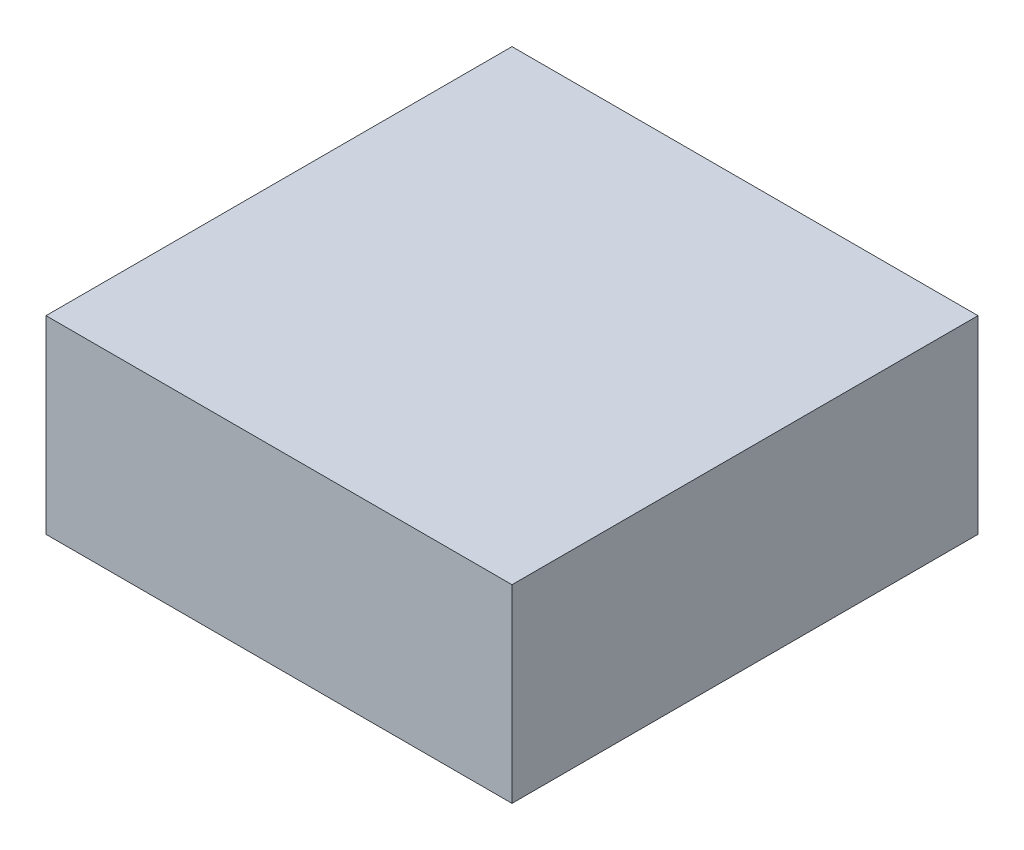
ISO-10303-21;
HEADER;
FILE_DESCRIPTION(('STEP AP214'),'2;1');
FILE_NAME('part.step','',(''),(''),'','','');
FILE_SCHEMA(('AUTOMOTIVE_DESIGN { 1 0 10303 214 1 1 1 1 }'));
ENDSEC;
DATA;
#1=APPLICATION_CONTEXT('core data for automotive mechanical design processes');
#2=APPLICATION_PROTOCOL_DEFINITION('international standard','automotive_design',2000,#1);
#3=PRODUCT_CONTEXT('',#1,'mechanical');
#4=PRODUCT('Part','Part','',(#3));
#5=PRODUCT_RELATED_PRODUCT_CATEGORY('part','',(#4));
#6=PRODUCT_DEFINITION_FORMATION('','',#4);
#7=PRODUCT_DEFINITION_CONTEXT('part definition',#1,'design');
#8=PRODUCT_DEFINITION('design','',#6,#7);
#9=PRODUCT_DEFINITION_SHAPE('','',#8);
#10=(LENGTH_UNIT() NAMED_UNIT(*) SI_UNIT(.MILLI.,.METRE.));
#11=(NAMED_UNIT(*) PLANE_ANGLE_UNIT() SI_UNIT($,.RADIAN.));
#12=(NAMED_UNIT(*) SI_UNIT($,.STERADIAN.) SOLID_ANGLE_UNIT());
#13=UNCERTAINTY_MEASURE_WITH_UNIT(LENGTH_MEASURE(1.E-05),#10,'distance_accuracy_value','');
#14=(GEOMETRIC_REPRESENTATION_CONTEXT(3) GLOBAL_UNCERTAINTY_ASSIGNED_CONTEXT((#13)) GLOBAL_UNIT_ASSIGNED_CONTEXT((#10,
#11,#12)) REPRESENTATION_CONTEXT('',''));
#15=CARTESIAN_POINT('',(0.,0.,0.));
#16=DIRECTION('',(0.,0.,1.));
#17=DIRECTION('',(1.,0.,0.));
#18=AXIS2_PLACEMENT_3D('',#15,#16,#17);
#19=CARTESIAN_POINT('',(7.75,6.3,7.75));
#20=DIRECTION('',(-1.,0.,0.));
#21=DIRECTION('',(0.,0.,1.));
#22=AXIS2_PLACEMENT_3D('',#19,#20,#21);
#23=PLANE('',#22);
#24=DIRECTION('',(0.,0.,-1.));
#25=VECTOR('',#24,1.);
#26=CARTESIAN_POINT('',(7.75,0.,7.75));
#27=LINE('',#26,#25);
#28=CARTESIAN_POINT('',(7.75,0.,7.75));
#29=VERTEX_POINT('',#28);
#30=CARTESIAN_POINT('',(7.75,0.,-7.75));
#31=VERTEX_POINT('',#30);
#32=EDGE_CURVE('E110',#29,#31,#27,.T.);
#33=ORIENTED_EDGE('',*,*,#32,.T.);
#34=DIRECTION('',(0.,-1.,0.));
#35=VECTOR('',#34,1.);
#36=CARTESIAN_POINT('',(7.75,6.3,-7.75));
#37=LINE('',#36,#35);
#38=CARTESIAN_POINT('',(7.75,6.3,-7.75));
#39=VERTEX_POINT('',#38);
#40=EDGE_CURVE('E11',#39,#31,#37,.T.);
#41=ORIENTED_EDGE('',*,*,#40,.F.);
#42=DIRECTION('',(0.,0.,-1.));
#43=VECTOR('',#42,1.);
#44=CARTESIAN_POINT('',(7.75,6.3,7.75));
#45=LINE('',#44,#43);
#46=CARTESIAN_POINT('',(7.75,6.3,7.75));
#47=VERTEX_POINT('',#46);
#48=EDGE_CURVE('E94',#47,#39,#45,.T.);
#49=ORIENTED_EDGE('',*,*,#48,.F.);
#50=DIRECTION('',(0.,-1.,0.));
#51=VECTOR('',#50,1.);
#52=CARTESIAN_POINT('',(7.75,6.3,7.75));
#53=LINE('',#52,#51);
#54=EDGE_CURVE('E106',#47,#29,#53,.T.);
#55=ORIENTED_EDGE('',*,*,#54,.T.);
#56=EDGE_LOOP('',(#33,#41,#49,#55));
#57=FACE_BOUND('',#56,.T.);
#58=ADVANCED_FACE('F42',(#57),#23,.F.);
#59=CARTESIAN_POINT('',(-7.75,6.3,-7.75));
#60=DIRECTION('',(0.,0.,1.));
#61=DIRECTION('',(1.,0.,0.));
#62=AXIS2_PLACEMENT_3D('',#59,#60,#61);
#63=PLANE('',#62);
#64=DIRECTION('',(-1.,0.,0.));
#65=VECTOR('',#64,1.);
#66=CARTESIAN_POINT('',(-7.75,0.,-7.75));
#67=LINE('',#66,#65);
#68=CARTESIAN_POINT('',(-7.75,0.,-7.75));
#69=VERTEX_POINT('',#68);
#70=EDGE_CURVE('E99',#31,#69,#67,.T.);
#71=ORIENTED_EDGE('',*,*,#70,.T.);
#72=DIRECTION('',(0.,-1.,0.));
#73=VECTOR('',#72,1.);
#74=CARTESIAN_POINT('',(-7.75,6.3,-7.75));
#75=LINE('',#74,#73);
#76=CARTESIAN_POINT('',(-7.75,6.3,-7.75));
#77=VERTEX_POINT('',#76);
#78=EDGE_CURVE('E51',#77,#69,#75,.T.);
#79=ORIENTED_EDGE('',*,*,#78,.F.);
#80=DIRECTION('',(-1.,0.,0.));
#81=VECTOR('',#80,1.);
#82=CARTESIAN_POINT('',(-7.75,6.3,-7.75));
#83=LINE('',#82,#81);
#84=EDGE_CURVE('E89',#39,#77,#83,.T.);
#85=ORIENTED_EDGE('',*,*,#84,.F.);
#86=ORIENTED_EDGE('',*,*,#40,.T.);
#87=EDGE_LOOP('',(#71,#79,#85,#86));
#88=FACE_BOUND('',#87,.T.);
#89=ADVANCED_FACE('F98',(#88),#63,.F.);
#90=CARTESIAN_POINT('',(-7.75,6.3,7.75));
#91=DIRECTION('',(1.,0.,0.));
#92=DIRECTION('',(0.,0.,-1.));
#93=AXIS2_PLACEMENT_3D('',#90,#91,#92);
#94=PLANE('',#93);
#95=DIRECTION('',(0.,0.,1.));
#96=VECTOR('',#95,1.);
#97=CARTESIAN_POINT('',(-7.75,0.,7.75));
#98=LINE('',#97,#96);
#99=CARTESIAN_POINT('',(-7.75,0.,7.75));
#100=VERTEX_POINT('',#99);
#101=EDGE_CURVE('E76',#69,#100,#98,.T.);
#102=ORIENTED_EDGE('',*,*,#101,.T.);
#103=DIRECTION('',(0.,-1.,0.));
#104=VECTOR('',#103,1.);
#105=CARTESIAN_POINT('',(-7.75,6.3,7.75));
#106=LINE('',#105,#104);
#107=CARTESIAN_POINT('',(-7.75,6.3,7.75));
#108=VERTEX_POINT('',#107);
#109=EDGE_CURVE('E101',#108,#100,#106,.T.);
#110=ORIENTED_EDGE('',*,*,#109,.F.);
#111=DIRECTION('',(0.,0.,1.));
#112=VECTOR('',#111,1.);
#113=CARTESIAN_POINT('',(-7.75,6.3,7.75));
#114=LINE('',#113,#112);
#115=EDGE_CURVE('E92',#77,#108,#114,.T.);
#116=ORIENTED_EDGE('',*,*,#115,.F.);
#117=ORIENTED_EDGE('',*,*,#78,.T.);
#118=EDGE_LOOP('',(#102,#110,#116,#117));
#119=FACE_BOUND('',#118,.T.);
#120=ADVANCED_FACE('F102',(#119),#94,.F.);
#121=CARTESIAN_POINT('',(-7.75,6.3,7.75));
#122=DIRECTION('',(0.,0.,-1.));
#123=DIRECTION('',(-1.,0.,0.));
#124=AXIS2_PLACEMENT_3D('',#121,#122,#123);
#125=PLANE('',#124);
#126=DIRECTION('',(1.,0.,0.));
#127=VECTOR('',#126,1.);
#128=CARTESIAN_POINT('',(-7.75,0.,7.75));
#129=LINE('',#128,#127);
#130=EDGE_CURVE('E82',#100,#29,#129,.T.);
#131=ORIENTED_EDGE('',*,*,#130,.T.);
#132=ORIENTED_EDGE('',*,*,#54,.F.);
#133=DIRECTION('',(1.,0.,0.));
#134=VECTOR('',#133,1.);
#135=CARTESIAN_POINT('',(-7.75,6.3,7.75));
#136=LINE('',#135,#134);
#137=EDGE_CURVE('E59',#108,#47,#136,.T.);
#138=ORIENTED_EDGE('',*,*,#137,.F.);
#139=ORIENTED_EDGE('',*,*,#109,.T.);
#140=EDGE_LOOP('',(#131,#132,#138,#139));
#141=FACE_BOUND('',#140,.T.);
#142=ADVANCED_FACE('F123',(#141),#125,.F.);
#143=CARTESIAN_POINT('',(0.,6.3,0.));
#144=DIRECTION('',(0.,-1.,0.));
#145=DIRECTION('',(0.,0.,-1.));
#146=AXIS2_PLACEMENT_3D('',#143,#144,#145);
#147=PLANE('',#146);
#148=ORIENTED_EDGE('',*,*,#48,.T.);
#149=ORIENTED_EDGE('',*,*,#84,.T.);
#150=ORIENTED_EDGE('',*,*,#115,.T.);
#151=ORIENTED_EDGE('',*,*,#137,.T.);
#152=EDGE_LOOP('',(#148,#149,#150,#151));
#153=FACE_BOUND('',#152,.T.);
#154=ADVANCED_FACE('F90',(#153),#147,.F.);
#155=CARTESIAN_POINT('',(0.,0.,0.));
#156=DIRECTION('',(0.,-1.,0.));
#157=DIRECTION('',(0.,0.,-1.));
#158=AXIS2_PLACEMENT_3D('',#155,#156,#157);
#159=PLANE('',#158);
#160=ORIENTED_EDGE('',*,*,#32,.F.);
#161=ORIENTED_EDGE('',*,*,#130,.F.);
#162=ORIENTED_EDGE('',*,*,#101,.F.);
#163=ORIENTED_EDGE('',*,*,#70,.F.);
#164=EDGE_LOOP('',(#160,#161,#162,#163));
#165=FACE_BOUND('',#164,.T.);
#166=ADVANCED_FACE('F126',(#165),#159,.T.);
#167=CLOSED_SHELL('',(#58,#89,#120,#142,#154,#166));
#168=MANIFOLD_SOLID_BREP('B2',#167);
#169=ADVANCED_BREP_SHAPE_REPRESENTATION('',(#18,#168),#14);
#170=SHAPE_DEFINITION_REPRESENTATION(#9,#169);
ENDSEC;
END-ISO-10303-21;
